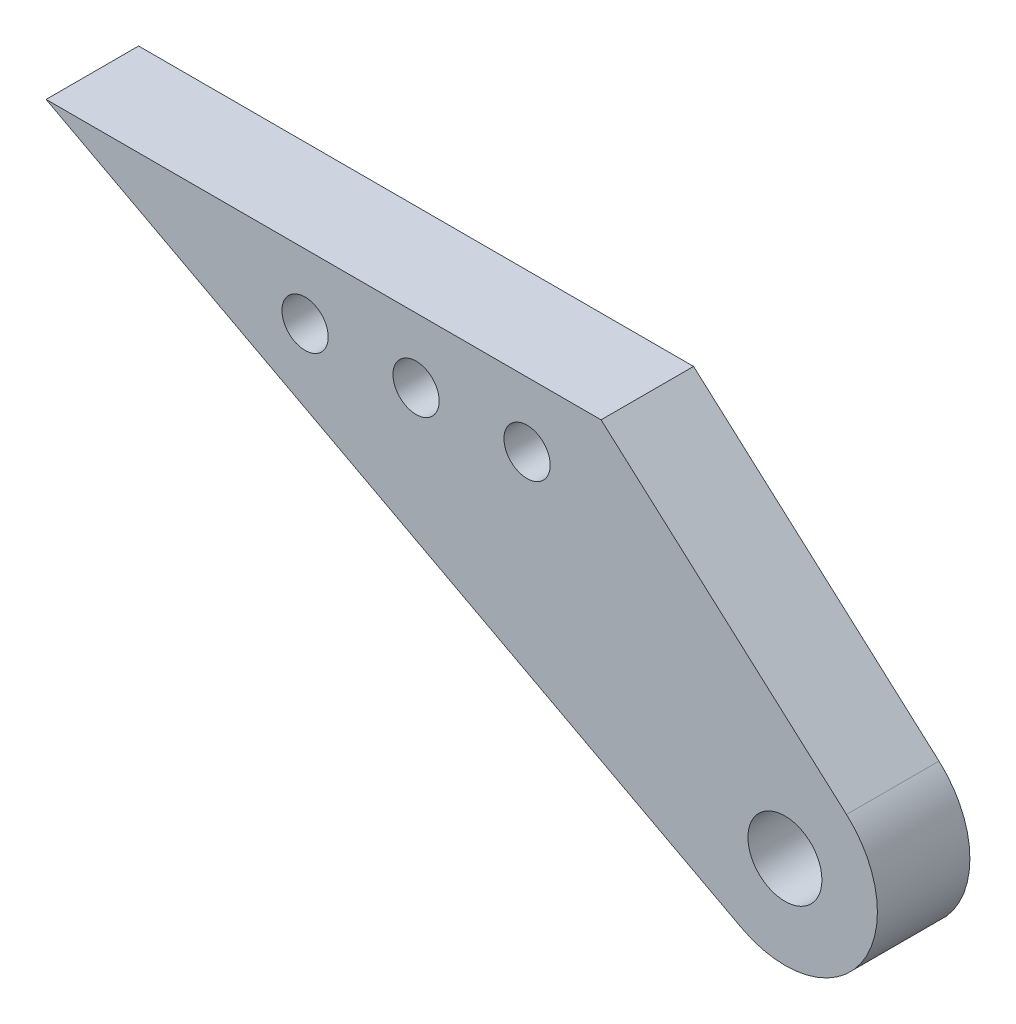
ISO-10303-21;
HEADER;
FILE_DESCRIPTION(('STEP AP214'),'2;1');
FILE_NAME('part.step','',(''),(''),'','','');
FILE_SCHEMA(('AUTOMOTIVE_DESIGN { 1 0 10303 214 1 1 1 1 }'));
ENDSEC;
DATA;
#1=APPLICATION_CONTEXT('core data for automotive mechanical design processes');
#2=APPLICATION_PROTOCOL_DEFINITION('international standard','automotive_design',2000,#1);
#3=PRODUCT_CONTEXT('',#1,'mechanical');
#4=PRODUCT('Part','Part','',(#3));
#5=PRODUCT_RELATED_PRODUCT_CATEGORY('part','',(#4));
#6=PRODUCT_DEFINITION_FORMATION('','',#4);
#7=PRODUCT_DEFINITION_CONTEXT('part definition',#1,'design');
#8=PRODUCT_DEFINITION('design','',#6,#7);
#9=PRODUCT_DEFINITION_SHAPE('','',#8);
#10=(LENGTH_UNIT() NAMED_UNIT(*) SI_UNIT(.MILLI.,.METRE.));
#11=(NAMED_UNIT(*) PLANE_ANGLE_UNIT() SI_UNIT($,.RADIAN.));
#12=(NAMED_UNIT(*) SI_UNIT($,.STERADIAN.) SOLID_ANGLE_UNIT());
#13=UNCERTAINTY_MEASURE_WITH_UNIT(LENGTH_MEASURE(1.E-05),#10,'distance_accuracy_value','');
#14=(GEOMETRIC_REPRESENTATION_CONTEXT(3) GLOBAL_UNCERTAINTY_ASSIGNED_CONTEXT((#13)) GLOBAL_UNIT_ASSIGNED_CONTEXT((#10,
#11,#12)) REPRESENTATION_CONTEXT('',''));
#15=CARTESIAN_POINT('',(0.,0.,0.));
#16=DIRECTION('',(0.,0.,1.));
#17=DIRECTION('',(1.,0.,0.));
#18=AXIS2_PLACEMENT_3D('',#15,#16,#17);
#19=CARTESIAN_POINT('',(9.93808075896663,-15.5726039685549,5.));
#20=DIRECTION('',(0.,0.,1.));
#21=DIRECTION('',(1.,0.,0.));
#22=AXIS2_PLACEMENT_3D('',#19,#20,#21);
#23=PLANE('',#22);
#24=CARTESIAN_POINT('',(-4.,-3.5,5.));
#25=DIRECTION('',(0.,0.,1.));
#26=DIRECTION('',(1.,0.,0.));
#27=AXIS2_PLACEMENT_3D('',#24,#25,#26);
#28=CIRCLE('',#27,1.25);
#29=CARTESIAN_POINT('',(-2.75,-3.5,5.));
#30=VERTEX_POINT('',#29);
#31=EDGE_CURVE('E123',#30,#30,#28,.T.);
#32=ORIENTED_EDGE('',*,*,#31,.F.);
#33=EDGE_LOOP('',(#32));
#34=FACE_BOUND('',#33,.T.);
#35=CARTESIAN_POINT('',(9.93808075896663,-15.5726039685549,5.));
#36=DIRECTION('',(0.,0.,1.));
#37=DIRECTION('',(1.,0.,0.));
#38=AXIS2_PLACEMENT_3D('',#35,#36,#37);
#39=CIRCLE('',#38,2.);
#40=CARTESIAN_POINT('',(11.9380807589666,-15.5726039685549,5.));
#41=VERTEX_POINT('',#40);
#42=EDGE_CURVE('E102',#41,#41,#39,.T.);
#43=ORIENTED_EDGE('',*,*,#42,.F.);
#44=EDGE_LOOP('',(#43));
#45=FACE_BOUND('',#44,.T.);
#46=DIRECTION('',(0.88294759285893,-0.469471562785885,0.));
#47=VECTOR('',#46,1.);
#48=CARTESIAN_POINT('',(7.5907229450372,-19.9873419328495,5.));
#49=LINE('',#48,#47);
#50=CARTESIAN_POINT('',(-30.,0.,5.));
#51=VERTEX_POINT('',#50);
#52=CARTESIAN_POINT('',(7.5907229450372,-19.9873419328495,5.));
#53=VERTEX_POINT('',#52);
#54=EDGE_CURVE('E87',#51,#53,#49,.T.);
#55=ORIENTED_EDGE('',*,*,#54,.T.);
#56=CARTESIAN_POINT('',(9.93808075896663,-15.5726039685549,5.));
#57=DIRECTION('',(0.,0.,1.));
#58=DIRECTION('',(1.,0.,0.));
#59=AXIS2_PLACEMENT_3D('',#56,#57,#58);
#60=CIRCLE('',#59,5.);
#61=CARTESIAN_POINT('',(13.2675877290148,-11.8424051351949,5.));
#62=VERTEX_POINT('',#61);
#63=EDGE_CURVE('E82',#53,#62,#60,.T.);
#64=ORIENTED_EDGE('',*,*,#63,.T.);
#65=DIRECTION('',(-0.746039766672006,0.665901394009638,0.));
#66=VECTOR('',#65,1.);
#67=CARTESIAN_POINT('',(0.,0.,5.));
#68=LINE('',#67,#66);
#69=CARTESIAN_POINT('',(0.,0.,5.));
#70=VERTEX_POINT('',#69);
#71=EDGE_CURVE('E85',#62,#70,#68,.T.);
#72=ORIENTED_EDGE('',*,*,#71,.T.);
#73=DIRECTION('',(-1.,0.,0.));
#74=VECTOR('',#73,1.);
#75=CARTESIAN_POINT('',(-30.,0.,5.));
#76=LINE('',#75,#74);
#77=EDGE_CURVE('E52',#70,#51,#76,.T.);
#78=ORIENTED_EDGE('',*,*,#77,.T.);
#79=EDGE_LOOP('',(#55,#64,#72,#78));
#80=FACE_BOUND('',#79,.T.);
#81=CARTESIAN_POINT('',(-10.,-3.50000000000004,5.));
#82=DIRECTION('',(0.,0.,1.));
#83=DIRECTION('',(1.,0.,0.));
#84=AXIS2_PLACEMENT_3D('',#81,#82,#83);
#85=CIRCLE('',#84,1.25);
#86=CARTESIAN_POINT('',(-8.75,-3.50000000000004,5.));
#87=VERTEX_POINT('',#86);
#88=EDGE_CURVE('E117',#87,#87,#85,.T.);
#89=ORIENTED_EDGE('',*,*,#88,.F.);
#90=EDGE_LOOP('',(#89));
#91=FACE_BOUND('',#90,.T.);
#92=CARTESIAN_POINT('',(-16.,-3.50000000000008,5.));
#93=DIRECTION('',(0.,0.,1.));
#94=DIRECTION('',(1.,0.,0.));
#95=AXIS2_PLACEMENT_3D('',#92,#93,#94);
#96=CIRCLE('',#95,1.25);
#97=CARTESIAN_POINT('',(-14.75,-3.50000000000008,5.));
#98=VERTEX_POINT('',#97);
#99=EDGE_CURVE('E129',#98,#98,#96,.T.);
#100=ORIENTED_EDGE('',*,*,#99,.F.);
#101=EDGE_LOOP('',(#100));
#102=FACE_BOUND('',#101,.T.);
#103=ADVANCED_FACE('F35',(#34,#45,#80,#91,#102),#23,.T.);
#104=CARTESIAN_POINT('',(9.93808075896663,-15.5726039685549,0.));
#105=DIRECTION('',(0.,0.,1.));
#106=DIRECTION('',(1.,0.,0.));
#107=AXIS2_PLACEMENT_3D('',#104,#105,#106);
#108=PLANE('',#107);
#109=DIRECTION('',(0.88294759285893,-0.469471562785885,0.));
#110=VECTOR('',#109,1.);
#111=CARTESIAN_POINT('',(7.5907229450372,-19.9873419328495,0.));
#112=LINE('',#111,#110);
#113=CARTESIAN_POINT('',(-30.,0.,0.));
#114=VERTEX_POINT('',#113);
#115=CARTESIAN_POINT('',(7.5907229450372,-19.9873419328495,0.));
#116=VERTEX_POINT('',#115);
#117=EDGE_CURVE('E99',#114,#116,#112,.T.);
#118=ORIENTED_EDGE('',*,*,#117,.F.);
#119=DIRECTION('',(-1.,0.,0.));
#120=VECTOR('',#119,1.);
#121=CARTESIAN_POINT('',(-30.,0.,0.));
#122=LINE('',#121,#120);
#123=CARTESIAN_POINT('',(0.,0.,0.));
#124=VERTEX_POINT('',#123);
#125=EDGE_CURVE('E75',#124,#114,#122,.T.);
#126=ORIENTED_EDGE('',*,*,#125,.F.);
#127=DIRECTION('',(-0.746039766672006,0.665901394009638,0.));
#128=VECTOR('',#127,1.);
#129=CARTESIAN_POINT('',(0.,0.,0.));
#130=LINE('',#129,#128);
#131=CARTESIAN_POINT('',(13.2675877290148,-11.8424051351949,0.));
#132=VERTEX_POINT('',#131);
#133=EDGE_CURVE('E69',#132,#124,#130,.T.);
#134=ORIENTED_EDGE('',*,*,#133,.F.);
#135=CARTESIAN_POINT('',(9.93808075896663,-15.5726039685549,0.));
#136=DIRECTION('',(0.,0.,1.));
#137=DIRECTION('',(1.,0.,0.));
#138=AXIS2_PLACEMENT_3D('',#135,#136,#137);
#139=CIRCLE('',#138,5.);
#140=EDGE_CURVE('E91',#116,#132,#139,.T.);
#141=ORIENTED_EDGE('',*,*,#140,.F.);
#142=EDGE_LOOP('',(#118,#126,#134,#141));
#143=FACE_BOUND('',#142,.T.);
#144=CARTESIAN_POINT('',(9.93808075896663,-15.5726039685549,0.));
#145=DIRECTION('',(0.,0.,1.));
#146=DIRECTION('',(1.,0.,0.));
#147=AXIS2_PLACEMENT_3D('',#144,#145,#146);
#148=CIRCLE('',#147,2.);
#149=CARTESIAN_POINT('',(11.9380807589666,-15.5726039685549,0.));
#150=VERTEX_POINT('',#149);
#151=EDGE_CURVE('E114',#150,#150,#148,.T.);
#152=ORIENTED_EDGE('',*,*,#151,.T.);
#153=EDGE_LOOP('',(#152));
#154=FACE_BOUND('',#153,.T.);
#155=CARTESIAN_POINT('',(-10.,-3.50000000000004,0.));
#156=DIRECTION('',(0.,0.,1.));
#157=DIRECTION('',(1.,0.,0.));
#158=AXIS2_PLACEMENT_3D('',#155,#156,#157);
#159=CIRCLE('',#158,1.25);
#160=CARTESIAN_POINT('',(-8.75,-3.50000000000004,0.));
#161=VERTEX_POINT('',#160);
#162=EDGE_CURVE('E120',#161,#161,#159,.T.);
#163=ORIENTED_EDGE('',*,*,#162,.T.);
#164=EDGE_LOOP('',(#163));
#165=FACE_BOUND('',#164,.T.);
#166=CARTESIAN_POINT('',(-4.,-3.5,0.));
#167=DIRECTION('',(0.,0.,1.));
#168=DIRECTION('',(1.,0.,0.));
#169=AXIS2_PLACEMENT_3D('',#166,#167,#168);
#170=CIRCLE('',#169,1.25);
#171=CARTESIAN_POINT('',(-2.75,-3.5,0.));
#172=VERTEX_POINT('',#171);
#173=EDGE_CURVE('E126',#172,#172,#170,.T.);
#174=ORIENTED_EDGE('',*,*,#173,.T.);
#175=EDGE_LOOP('',(#174));
#176=FACE_BOUND('',#175,.T.);
#177=CARTESIAN_POINT('',(-16.,-3.50000000000008,0.));
#178=DIRECTION('',(0.,0.,1.));
#179=DIRECTION('',(1.,0.,0.));
#180=AXIS2_PLACEMENT_3D('',#177,#178,#179);
#181=CIRCLE('',#180,1.25);
#182=CARTESIAN_POINT('',(-14.75,-3.50000000000008,0.));
#183=VERTEX_POINT('',#182);
#184=EDGE_CURVE('E132',#183,#183,#181,.T.);
#185=ORIENTED_EDGE('',*,*,#184,.T.);
#186=EDGE_LOOP('',(#185));
#187=FACE_BOUND('',#186,.T.);
#188=ADVANCED_FACE('F110',(#143,#154,#165,#176,#187),#108,.F.);
#189=CARTESIAN_POINT('',(7.5907229450372,-19.9873419328495,5.));
#190=DIRECTION('',(0.469471562785885,0.88294759285893,0.));
#191=DIRECTION('',(-0.88294759285893,0.469471562785885,0.));
#192=AXIS2_PLACEMENT_3D('',#189,#190,#191);
#193=PLANE('',#192);
#194=ORIENTED_EDGE('',*,*,#117,.T.);
#195=DIRECTION('',(0.,0.,-1.));
#196=VECTOR('',#195,1.);
#197=CARTESIAN_POINT('',(7.5907229450372,-19.9873419328495,5.));
#198=LINE('',#197,#196);
#199=EDGE_CURVE('E11',#53,#116,#198,.T.);
#200=ORIENTED_EDGE('',*,*,#199,.F.);
#201=ORIENTED_EDGE('',*,*,#54,.F.);
#202=DIRECTION('',(0.,0.,-1.));
#203=VECTOR('',#202,1.);
#204=CARTESIAN_POINT('',(-30.,0.,5.));
#205=LINE('',#204,#203);
#206=EDGE_CURVE('E95',#51,#114,#205,.T.);
#207=ORIENTED_EDGE('',*,*,#206,.T.);
#208=EDGE_LOOP('',(#194,#200,#201,#207));
#209=FACE_BOUND('',#208,.T.);
#210=ADVANCED_FACE('F37',(#209),#193,.F.);
#211=CARTESIAN_POINT('',(9.93808075896663,-15.5726039685549,5.));
#212=DIRECTION('',(0.,0.,-1.));
#213=DIRECTION('',(-1.,0.,0.));
#214=AXIS2_PLACEMENT_3D('',#211,#212,#213);
#215=CYLINDRICAL_SURFACE('',#214,5.);
#216=ORIENTED_EDGE('',*,*,#140,.T.);
#217=DIRECTION('',(0.,0.,-1.));
#218=VECTOR('',#217,1.);
#219=CARTESIAN_POINT('',(13.2675877290148,-11.8424051351949,5.));
#220=LINE('',#219,#218);
#221=EDGE_CURVE('E44',#62,#132,#220,.T.);
#222=ORIENTED_EDGE('',*,*,#221,.F.);
#223=ORIENTED_EDGE('',*,*,#63,.F.);
#224=ORIENTED_EDGE('',*,*,#199,.T.);
#225=EDGE_LOOP('',(#216,#222,#223,#224));
#226=FACE_BOUND('',#225,.T.);
#227=ADVANCED_FACE('F90',(#226),#215,.T.);
#228=CARTESIAN_POINT('',(0.,0.,5.));
#229=DIRECTION('',(-0.665901394009638,-0.746039766672006,0.));
#230=DIRECTION('',(0.746039766672006,-0.665901394009638,0.));
#231=AXIS2_PLACEMENT_3D('',#228,#229,#230);
#232=PLANE('',#231);
#233=ORIENTED_EDGE('',*,*,#133,.T.);
#234=DIRECTION('',(0.,0.,-1.));
#235=VECTOR('',#234,1.);
#236=CARTESIAN_POINT('',(0.,0.,5.));
#237=LINE('',#236,#235);
#238=EDGE_CURVE('E92',#70,#124,#237,.T.);
#239=ORIENTED_EDGE('',*,*,#238,.F.);
#240=ORIENTED_EDGE('',*,*,#71,.F.);
#241=ORIENTED_EDGE('',*,*,#221,.T.);
#242=EDGE_LOOP('',(#233,#239,#240,#241));
#243=FACE_BOUND('',#242,.T.);
#244=ADVANCED_FACE('F93',(#243),#232,.F.);
#245=CARTESIAN_POINT('',(-30.,0.,5.));
#246=DIRECTION('',(0.,-1.,0.));
#247=DIRECTION('',(0.,0.,-1.));
#248=AXIS2_PLACEMENT_3D('',#245,#246,#247);
#249=PLANE('',#248);
#250=ORIENTED_EDGE('',*,*,#125,.T.);
#251=ORIENTED_EDGE('',*,*,#206,.F.);
#252=ORIENTED_EDGE('',*,*,#77,.F.);
#253=ORIENTED_EDGE('',*,*,#238,.T.);
#254=EDGE_LOOP('',(#250,#251,#252,#253));
#255=FACE_BOUND('',#254,.T.);
#256=ADVANCED_FACE('F107',(#255),#249,.F.);
#257=CARTESIAN_POINT('',(9.93808075896663,-15.5726039685549,5.));
#258=DIRECTION('',(0.,0.,-1.));
#259=DIRECTION('',(-1.,0.,0.));
#260=AXIS2_PLACEMENT_3D('',#257,#258,#259);
#261=CYLINDRICAL_SURFACE('',#260,2.);
#262=ORIENTED_EDGE('',*,*,#42,.T.);
#263=EDGE_LOOP('',(#262));
#264=FACE_BOUND('',#263,.T.);
#265=ORIENTED_EDGE('',*,*,#151,.F.);
#266=EDGE_LOOP('',(#265));
#267=FACE_BOUND('',#266,.T.);
#268=ADVANCED_FACE('F151',(#264,#267),#261,.F.);
#269=CARTESIAN_POINT('',(-10.,-3.50000000000004,5.));
#270=DIRECTION('',(0.,0.,-1.));
#271=DIRECTION('',(-1.,0.,0.));
#272=AXIS2_PLACEMENT_3D('',#269,#270,#271);
#273=CYLINDRICAL_SURFACE('',#272,1.25);
#274=ORIENTED_EDGE('',*,*,#88,.T.);
#275=EDGE_LOOP('',(#274));
#276=FACE_BOUND('',#275,.T.);
#277=ORIENTED_EDGE('',*,*,#162,.F.);
#278=EDGE_LOOP('',(#277));
#279=FACE_BOUND('',#278,.T.);
#280=ADVANCED_FACE('F197',(#276,#279),#273,.F.);
#281=CARTESIAN_POINT('',(-4.,-3.5,5.));
#282=DIRECTION('',(0.,0.,-1.));
#283=DIRECTION('',(-1.,0.,0.));
#284=AXIS2_PLACEMENT_3D('',#281,#282,#283);
#285=CYLINDRICAL_SURFACE('',#284,1.25);
#286=ORIENTED_EDGE('',*,*,#31,.T.);
#287=EDGE_LOOP('',(#286));
#288=FACE_BOUND('',#287,.T.);
#289=ORIENTED_EDGE('',*,*,#173,.F.);
#290=EDGE_LOOP('',(#289));
#291=FACE_BOUND('',#290,.T.);
#292=ADVANCED_FACE('F205',(#288,#291),#285,.F.);
#293=CARTESIAN_POINT('',(-16.,-3.50000000000008,5.));
#294=DIRECTION('',(0.,0.,-1.));
#295=DIRECTION('',(-1.,0.,0.));
#296=AXIS2_PLACEMENT_3D('',#293,#294,#295);
#297=CYLINDRICAL_SURFACE('',#296,1.25);
#298=ORIENTED_EDGE('',*,*,#99,.T.);
#299=EDGE_LOOP('',(#298));
#300=FACE_BOUND('',#299,.T.);
#301=ORIENTED_EDGE('',*,*,#184,.F.);
#302=EDGE_LOOP('',(#301));
#303=FACE_BOUND('',#302,.T.);
#304=ADVANCED_FACE('F138',(#300,#303),#297,.F.);
#305=CLOSED_SHELL('',(#103,#188,#210,#227,#244,#256,#268,#280,#292,#304));
#306=MANIFOLD_SOLID_BREP('B2',#305);
#307=ADVANCED_BREP_SHAPE_REPRESENTATION('',(#18,#306),#14);
#308=SHAPE_DEFINITION_REPRESENTATION(#9,#307);
ENDSEC;
END-ISO-10303-21;
